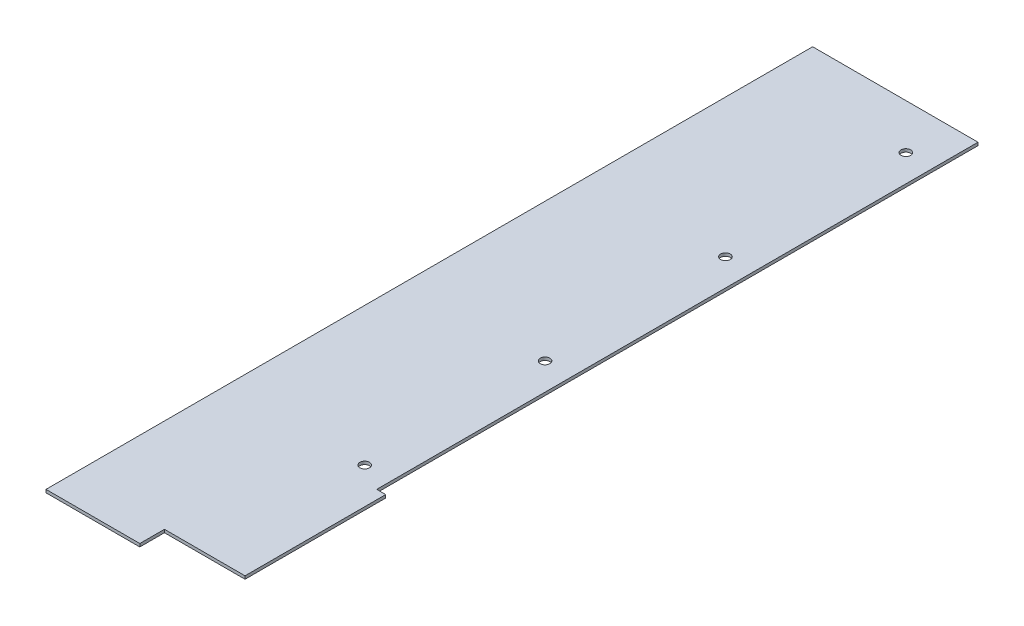
ISO-10303-21;
HEADER;
FILE_DESCRIPTION(('STEP AP214'),'2;1');
FILE_NAME('part.step','',(''),(''),'','','');
FILE_SCHEMA(('AUTOMOTIVE_DESIGN { 1 0 10303 214 1 1 1 1 }'));
ENDSEC;
DATA;
#1=APPLICATION_CONTEXT('core data for automotive mechanical design processes');
#2=APPLICATION_PROTOCOL_DEFINITION('international standard','automotive_design',2000,#1);
#3=PRODUCT_CONTEXT('',#1,'mechanical');
#4=PRODUCT('Part','Part','',(#3));
#5=PRODUCT_RELATED_PRODUCT_CATEGORY('part','',(#4));
#6=PRODUCT_DEFINITION_FORMATION('','',#4);
#7=PRODUCT_DEFINITION_CONTEXT('part definition',#1,'design');
#8=PRODUCT_DEFINITION('design','',#6,#7);
#9=PRODUCT_DEFINITION_SHAPE('','',#8);
#10=(LENGTH_UNIT() NAMED_UNIT(*) SI_UNIT(.MILLI.,.METRE.));
#11=(NAMED_UNIT(*) PLANE_ANGLE_UNIT() SI_UNIT($,.RADIAN.));
#12=(NAMED_UNIT(*) SI_UNIT($,.STERADIAN.) SOLID_ANGLE_UNIT());
#13=UNCERTAINTY_MEASURE_WITH_UNIT(LENGTH_MEASURE(1.E-05),#10,'distance_accuracy_value','');
#14=(GEOMETRIC_REPRESENTATION_CONTEXT(3) GLOBAL_UNCERTAINTY_ASSIGNED_CONTEXT((#13)) GLOBAL_UNIT_ASSIGNED_CONTEXT((#10,
#11,#12)) REPRESENTATION_CONTEXT('',''));
#15=CARTESIAN_POINT('',(0.,0.,0.));
#16=DIRECTION('',(0.,0.,1.));
#17=DIRECTION('',(1.,0.,0.));
#18=AXIS2_PLACEMENT_3D('',#15,#16,#17);
#19=CARTESIAN_POINT('',(0.,1.,0.));
#20=DIRECTION('',(0.,1.,0.));
#21=DIRECTION('',(0.,0.,1.));
#22=AXIS2_PLACEMENT_3D('',#19,#20,#21);
#23=PLANE('',#22);
#24=CARTESIAN_POINT('',(45.9999999999996,1.,-180.));
#25=DIRECTION('',(0.,1.,0.));
#26=DIRECTION('',(0.,0.,1.));
#27=AXIS2_PLACEMENT_3D('',#24,#25,#26);
#28=CIRCLE('',#27,1.6);
#29=CARTESIAN_POINT('',(45.9999999999996,1.,-178.4));
#30=VERTEX_POINT('',#29);
#31=EDGE_CURVE('E192',#30,#30,#28,.T.);
#32=ORIENTED_EDGE('',*,*,#31,.F.);
#33=EDGE_LOOP('',(#32));
#34=FACE_BOUND('',#33,.T.);
#35=CARTESIAN_POINT('',(46.,1.,-60.));
#36=DIRECTION('',(0.,1.,0.));
#37=DIRECTION('',(0.,0.,1.));
#38=AXIS2_PLACEMENT_3D('',#35,#36,#37);
#39=CIRCLE('',#38,1.6);
#40=CARTESIAN_POINT('',(46.,1.,-58.4));
#41=VERTEX_POINT('',#40);
#42=EDGE_CURVE('E136',#41,#41,#39,.T.);
#43=ORIENTED_EDGE('',*,*,#42,.F.);
#44=EDGE_LOOP('',(#43));
#45=FACE_BOUND('',#44,.T.);
#46=DIRECTION('',(1.,0.,0.));
#47=VECTOR('',#46,1.);
#48=CARTESIAN_POINT('',(0.,1.,0.));
#49=LINE('',#48,#47);
#50=CARTESIAN_POINT('',(0.,1.,0.));
#51=VERTEX_POINT('',#50);
#52=CARTESIAN_POINT('',(31.2,1.,0.));
#53=VERTEX_POINT('',#52);
#54=EDGE_CURVE('E148',#51,#53,#49,.T.);
#55=ORIENTED_EDGE('',*,*,#54,.T.);
#56=DIRECTION('',(0.,0.,-1.));
#57=VECTOR('',#56,1.);
#58=CARTESIAN_POINT('',(31.2,1.,0.));
#59=LINE('',#58,#57);
#60=CARTESIAN_POINT('',(31.2,1.,-8.2));
#61=VERTEX_POINT('',#60);
#62=EDGE_CURVE('E95',#53,#61,#59,.T.);
#63=ORIENTED_EDGE('',*,*,#62,.T.);
#64=DIRECTION('',(1.,0.,0.));
#65=VECTOR('',#64,1.);
#66=CARTESIAN_POINT('',(31.2,1.,-8.2));
#67=LINE('',#66,#65);
#68=CARTESIAN_POINT('',(58.,1.,-8.2));
#69=VERTEX_POINT('',#68);
#70=EDGE_CURVE('E162',#61,#69,#67,.T.);
#71=ORIENTED_EDGE('',*,*,#70,.T.);
#72=DIRECTION('',(0.,0.,-1.));
#73=VECTOR('',#72,1.);
#74=CARTESIAN_POINT('',(58.,1.,-55.));
#75=LINE('',#74,#73);
#76=CARTESIAN_POINT('',(58.,1.,-55.));
#77=VERTEX_POINT('',#76);
#78=EDGE_CURVE('E177',#69,#77,#75,.T.);
#79=ORIENTED_EDGE('',*,*,#78,.T.);
#80=DIRECTION('',(-1.,0.,0.));
#81=VECTOR('',#80,1.);
#82=CARTESIAN_POINT('',(55.,1.,-55.));
#83=LINE('',#82,#81);
#84=CARTESIAN_POINT('',(55.,1.,-55.));
#85=VERTEX_POINT('',#84);
#86=EDGE_CURVE('E114',#77,#85,#83,.T.);
#87=ORIENTED_EDGE('',*,*,#86,.T.);
#88=DIRECTION('',(0.,0.,-1.));
#89=VECTOR('',#88,1.);
#90=CARTESIAN_POINT('',(55.,1.,-255.));
#91=LINE('',#90,#89);
#92=CARTESIAN_POINT('',(55.,1.,-255.));
#93=VERTEX_POINT('',#92);
#94=EDGE_CURVE('E108',#85,#93,#91,.T.);
#95=ORIENTED_EDGE('',*,*,#94,.T.);
#96=DIRECTION('',(-1.,0.,0.));
#97=VECTOR('',#96,1.);
#98=CARTESIAN_POINT('',(0.,1.,-255.));
#99=LINE('',#98,#97);
#100=CARTESIAN_POINT('',(0.,1.,-255.));
#101=VERTEX_POINT('',#100);
#102=EDGE_CURVE('E112',#93,#101,#99,.T.);
#103=ORIENTED_EDGE('',*,*,#102,.T.);
#104=DIRECTION('',(0.,0.,1.));
#105=VECTOR('',#104,1.);
#106=CARTESIAN_POINT('',(0.,1.,0.));
#107=LINE('',#106,#105);
#108=EDGE_CURVE('E52',#101,#51,#107,.T.);
#109=ORIENTED_EDGE('',*,*,#108,.T.);
#110=EDGE_LOOP('',(#55,#63,#71,#79,#87,#95,#103,#109));
#111=FACE_BOUND('',#110,.T.);
#112=CARTESIAN_POINT('',(45.9999999999998,1.,-120.));
#113=DIRECTION('',(0.,1.,0.));
#114=DIRECTION('',(0.,0.,1.));
#115=AXIS2_PLACEMENT_3D('',#112,#113,#114);
#116=CIRCLE('',#115,1.6);
#117=CARTESIAN_POINT('',(45.9999999999998,1.,-118.4));
#118=VERTEX_POINT('',#117);
#119=EDGE_CURVE('E186',#118,#118,#116,.T.);
#120=ORIENTED_EDGE('',*,*,#119,.F.);
#121=EDGE_LOOP('',(#120));
#122=FACE_BOUND('',#121,.T.);
#123=CARTESIAN_POINT('',(45.9999999999994,1.,-240.));
#124=DIRECTION('',(0.,1.,0.));
#125=DIRECTION('',(0.,0.,1.));
#126=AXIS2_PLACEMENT_3D('',#123,#124,#125);
#127=CIRCLE('',#126,1.6);
#128=CARTESIAN_POINT('',(45.9999999999994,1.,-238.4));
#129=VERTEX_POINT('',#128);
#130=EDGE_CURVE('E198',#129,#129,#127,.T.);
#131=ORIENTED_EDGE('',*,*,#130,.F.);
#132=EDGE_LOOP('',(#131));
#133=FACE_BOUND('',#132,.T.);
#134=ADVANCED_FACE('F35',(#34,#45,#111,#122,#133),#23,.T.);
#135=CARTESIAN_POINT('',(0.,0.,0.));
#136=DIRECTION('',(0.,1.,0.));
#137=DIRECTION('',(0.,0.,1.));
#138=AXIS2_PLACEMENT_3D('',#135,#136,#137);
#139=PLANE('',#138);
#140=CARTESIAN_POINT('',(45.9999999999996,0.,-180.));
#141=DIRECTION('',(0.,1.,0.));
#142=DIRECTION('',(0.,0.,1.));
#143=AXIS2_PLACEMENT_3D('',#140,#141,#142);
#144=CIRCLE('',#143,1.6);
#145=CARTESIAN_POINT('',(45.9999999999996,0.,-178.4));
#146=VERTEX_POINT('',#145);
#147=EDGE_CURVE('E195',#146,#146,#144,.T.);
#148=ORIENTED_EDGE('',*,*,#147,.T.);
#149=EDGE_LOOP('',(#148));
#150=FACE_BOUND('',#149,.T.);
#151=CARTESIAN_POINT('',(46.,0.,-60.));
#152=DIRECTION('',(0.,1.,0.));
#153=DIRECTION('',(0.,0.,1.));
#154=AXIS2_PLACEMENT_3D('',#151,#152,#153);
#155=CIRCLE('',#154,1.6);
#156=CARTESIAN_POINT('',(46.,0.,-58.4));
#157=VERTEX_POINT('',#156);
#158=EDGE_CURVE('E183',#157,#157,#155,.T.);
#159=ORIENTED_EDGE('',*,*,#158,.T.);
#160=EDGE_LOOP('',(#159));
#161=FACE_BOUND('',#160,.T.);
#162=DIRECTION('',(1.,0.,0.));
#163=VECTOR('',#162,1.);
#164=CARTESIAN_POINT('',(0.,0.,0.));
#165=LINE('',#164,#163);
#166=CARTESIAN_POINT('',(0.,0.,0.));
#167=VERTEX_POINT('',#166);
#168=CARTESIAN_POINT('',(31.2,0.,0.));
#169=VERTEX_POINT('',#168);
#170=EDGE_CURVE('E132',#167,#169,#165,.T.);
#171=ORIENTED_EDGE('',*,*,#170,.F.);
#172=DIRECTION('',(0.,0.,1.));
#173=VECTOR('',#172,1.);
#174=CARTESIAN_POINT('',(0.,0.,0.));
#175=LINE('',#174,#173);
#176=CARTESIAN_POINT('',(0.,0.,-255.));
#177=VERTEX_POINT('',#176);
#178=EDGE_CURVE('E87',#177,#167,#175,.T.);
#179=ORIENTED_EDGE('',*,*,#178,.F.);
#180=DIRECTION('',(-1.,0.,0.));
#181=VECTOR('',#180,1.);
#182=CARTESIAN_POINT('',(0.,0.,-255.));
#183=LINE('',#182,#181);
#184=CARTESIAN_POINT('',(55.,0.,-255.));
#185=VERTEX_POINT('',#184);
#186=EDGE_CURVE('E81',#185,#177,#183,.T.);
#187=ORIENTED_EDGE('',*,*,#186,.F.);
#188=DIRECTION('',(0.,0.,-1.));
#189=VECTOR('',#188,1.);
#190=CARTESIAN_POINT('',(55.,0.,-255.));
#191=LINE('',#190,#189);
#192=CARTESIAN_POINT('',(55.,0.,-55.));
#193=VERTEX_POINT('',#192);
#194=EDGE_CURVE('E122',#193,#185,#191,.T.);
#195=ORIENTED_EDGE('',*,*,#194,.F.);
#196=DIRECTION('',(-1.,0.,0.));
#197=VECTOR('',#196,1.);
#198=CARTESIAN_POINT('',(55.,0.,-55.));
#199=LINE('',#198,#197);
#200=CARTESIAN_POINT('',(58.,0.,-55.));
#201=VERTEX_POINT('',#200);
#202=EDGE_CURVE('E143',#201,#193,#199,.T.);
#203=ORIENTED_EDGE('',*,*,#202,.F.);
#204=DIRECTION('',(0.,0.,-1.));
#205=VECTOR('',#204,1.);
#206=CARTESIAN_POINT('',(58.,0.,-55.));
#207=LINE('',#206,#205);
#208=CARTESIAN_POINT('',(58.,0.,-8.2));
#209=VERTEX_POINT('',#208);
#210=EDGE_CURVE('E141',#209,#201,#207,.T.);
#211=ORIENTED_EDGE('',*,*,#210,.F.);
#212=DIRECTION('',(1.,0.,0.));
#213=VECTOR('',#212,1.);
#214=CARTESIAN_POINT('',(58.,0.,-8.2));
#215=LINE('',#214,#213);
#216=CARTESIAN_POINT('',(31.2,0.,-8.2));
#217=VERTEX_POINT('',#216);
#218=EDGE_CURVE('E139',#217,#209,#215,.T.);
#219=ORIENTED_EDGE('',*,*,#218,.F.);
#220=DIRECTION('',(0.,0.,-1.));
#221=VECTOR('',#220,1.);
#222=CARTESIAN_POINT('',(31.2,0.,0.));
#223=LINE('',#222,#221);
#224=EDGE_CURVE('E135',#169,#217,#223,.T.);
#225=ORIENTED_EDGE('',*,*,#224,.F.);
#226=EDGE_LOOP('',(#171,#179,#187,#195,#203,#211,#219,#225));
#227=FACE_BOUND('',#226,.T.);
#228=CARTESIAN_POINT('',(45.9999999999998,0.,-120.));
#229=DIRECTION('',(0.,1.,0.));
#230=DIRECTION('',(0.,0.,1.));
#231=AXIS2_PLACEMENT_3D('',#228,#229,#230);
#232=CIRCLE('',#231,1.6);
#233=CARTESIAN_POINT('',(45.9999999999998,0.,-118.4));
#234=VERTEX_POINT('',#233);
#235=EDGE_CURVE('E189',#234,#234,#232,.T.);
#236=ORIENTED_EDGE('',*,*,#235,.T.);
#237=EDGE_LOOP('',(#236));
#238=FACE_BOUND('',#237,.T.);
#239=CARTESIAN_POINT('',(45.9999999999994,0.,-240.));
#240=DIRECTION('',(0.,1.,0.));
#241=DIRECTION('',(0.,0.,1.));
#242=AXIS2_PLACEMENT_3D('',#239,#240,#241);
#243=CIRCLE('',#242,1.6);
#244=CARTESIAN_POINT('',(45.9999999999994,0.,-238.4));
#245=VERTEX_POINT('',#244);
#246=EDGE_CURVE('E201',#245,#245,#243,.T.);
#247=ORIENTED_EDGE('',*,*,#246,.T.);
#248=EDGE_LOOP('',(#247));
#249=FACE_BOUND('',#248,.T.);
#250=ADVANCED_FACE('F167',(#150,#161,#227,#238,#249),#139,.F.);
#251=CARTESIAN_POINT('',(0.,1.,0.));
#252=DIRECTION('',(0.,0.,-1.));
#253=DIRECTION('',(-1.,0.,0.));
#254=AXIS2_PLACEMENT_3D('',#251,#252,#253);
#255=PLANE('',#254);
#256=ORIENTED_EDGE('',*,*,#170,.T.);
#257=DIRECTION('',(0.,-1.,0.));
#258=VECTOR('',#257,1.);
#259=CARTESIAN_POINT('',(31.2,1.,0.));
#260=LINE('',#259,#258);
#261=EDGE_CURVE('E11',#53,#169,#260,.T.);
#262=ORIENTED_EDGE('',*,*,#261,.F.);
#263=ORIENTED_EDGE('',*,*,#54,.F.);
#264=DIRECTION('',(0.,-1.,0.));
#265=VECTOR('',#264,1.);
#266=CARTESIAN_POINT('',(0.,1.,0.));
#267=LINE('',#266,#265);
#268=EDGE_CURVE('E128',#51,#167,#267,.T.);
#269=ORIENTED_EDGE('',*,*,#268,.T.);
#270=EDGE_LOOP('',(#256,#262,#263,#269));
#271=FACE_BOUND('',#270,.T.);
#272=ADVANCED_FACE('F37',(#271),#255,.F.);
#273=CARTESIAN_POINT('',(31.2,1.,0.));
#274=DIRECTION('',(-1.,0.,0.));
#275=DIRECTION('',(0.,0.,1.));
#276=AXIS2_PLACEMENT_3D('',#273,#274,#275);
#277=PLANE('',#276);
#278=ORIENTED_EDGE('',*,*,#224,.T.);
#279=DIRECTION('',(0.,-1.,0.));
#280=VECTOR('',#279,1.);
#281=CARTESIAN_POINT('',(31.2,1.,-8.2));
#282=LINE('',#281,#280);
#283=EDGE_CURVE('E44',#61,#217,#282,.T.);
#284=ORIENTED_EDGE('',*,*,#283,.F.);
#285=ORIENTED_EDGE('',*,*,#62,.F.);
#286=ORIENTED_EDGE('',*,*,#261,.T.);
#287=EDGE_LOOP('',(#278,#284,#285,#286));
#288=FACE_BOUND('',#287,.T.);
#289=ADVANCED_FACE('F163',(#288),#277,.F.);
#290=CARTESIAN_POINT('',(58.,1.,-8.2));
#291=DIRECTION('',(0.,0.,-1.));
#292=DIRECTION('',(-1.,0.,0.));
#293=AXIS2_PLACEMENT_3D('',#290,#291,#292);
#294=PLANE('',#293);
#295=ORIENTED_EDGE('',*,*,#218,.T.);
#296=DIRECTION('',(0.,-1.,0.));
#297=VECTOR('',#296,1.);
#298=CARTESIAN_POINT('',(58.,1.,-8.2));
#299=LINE('',#298,#297);
#300=EDGE_CURVE('E155',#69,#209,#299,.T.);
#301=ORIENTED_EDGE('',*,*,#300,.F.);
#302=ORIENTED_EDGE('',*,*,#70,.F.);
#303=ORIENTED_EDGE('',*,*,#283,.T.);
#304=EDGE_LOOP('',(#295,#301,#302,#303));
#305=FACE_BOUND('',#304,.T.);
#306=ADVANCED_FACE('F160',(#305),#294,.F.);
#307=CARTESIAN_POINT('',(58.,1.,-55.));
#308=DIRECTION('',(-1.,0.,0.));
#309=DIRECTION('',(0.,0.,1.));
#310=AXIS2_PLACEMENT_3D('',#307,#308,#309);
#311=PLANE('',#310);
#312=ORIENTED_EDGE('',*,*,#210,.T.);
#313=DIRECTION('',(0.,-1.,0.));
#314=VECTOR('',#313,1.);
#315=CARTESIAN_POINT('',(58.,1.,-55.));
#316=LINE('',#315,#314);
#317=EDGE_CURVE('E152',#77,#201,#316,.T.);
#318=ORIENTED_EDGE('',*,*,#317,.F.);
#319=ORIENTED_EDGE('',*,*,#78,.F.);
#320=ORIENTED_EDGE('',*,*,#300,.T.);
#321=EDGE_LOOP('',(#312,#318,#319,#320));
#322=FACE_BOUND('',#321,.T.);
#323=ADVANCED_FACE('F173',(#322),#311,.F.);
#324=CARTESIAN_POINT('',(55.,1.,-55.));
#325=DIRECTION('',(0.,0.,1.));
#326=DIRECTION('',(1.,0.,0.));
#327=AXIS2_PLACEMENT_3D('',#324,#325,#326);
#328=PLANE('',#327);
#329=ORIENTED_EDGE('',*,*,#202,.T.);
#330=DIRECTION('',(0.,-1.,0.));
#331=VECTOR('',#330,1.);
#332=CARTESIAN_POINT('',(55.,1.,-55.));
#333=LINE('',#332,#331);
#334=EDGE_CURVE('E123',#85,#193,#333,.T.);
#335=ORIENTED_EDGE('',*,*,#334,.F.);
#336=ORIENTED_EDGE('',*,*,#86,.F.);
#337=ORIENTED_EDGE('',*,*,#317,.T.);
#338=EDGE_LOOP('',(#329,#335,#336,#337));
#339=FACE_BOUND('',#338,.T.);
#340=ADVANCED_FACE('F176',(#339),#328,.F.);
#341=CARTESIAN_POINT('',(55.,1.,-255.));
#342=DIRECTION('',(-1.,0.,0.));
#343=DIRECTION('',(0.,0.,1.));
#344=AXIS2_PLACEMENT_3D('',#341,#342,#343);
#345=PLANE('',#344);
#346=ORIENTED_EDGE('',*,*,#194,.T.);
#347=DIRECTION('',(0.,-1.,0.));
#348=VECTOR('',#347,1.);
#349=CARTESIAN_POINT('',(55.,1.,-255.));
#350=LINE('',#349,#348);
#351=EDGE_CURVE('E119',#93,#185,#350,.T.);
#352=ORIENTED_EDGE('',*,*,#351,.F.);
#353=ORIENTED_EDGE('',*,*,#94,.F.);
#354=ORIENTED_EDGE('',*,*,#334,.T.);
#355=EDGE_LOOP('',(#346,#352,#353,#354));
#356=FACE_BOUND('',#355,.T.);
#357=ADVANCED_FACE('F120',(#356),#345,.F.);
#358=CARTESIAN_POINT('',(0.,1.,-255.));
#359=DIRECTION('',(0.,0.,1.));
#360=DIRECTION('',(1.,0.,0.));
#361=AXIS2_PLACEMENT_3D('',#358,#359,#360);
#362=PLANE('',#361);
#363=ORIENTED_EDGE('',*,*,#186,.T.);
#364=DIRECTION('',(0.,-1.,0.));
#365=VECTOR('',#364,1.);
#366=CARTESIAN_POINT('',(0.,1.,-255.));
#367=LINE('',#366,#365);
#368=EDGE_CURVE('E124',#101,#177,#367,.T.);
#369=ORIENTED_EDGE('',*,*,#368,.F.);
#370=ORIENTED_EDGE('',*,*,#102,.F.);
#371=ORIENTED_EDGE('',*,*,#351,.T.);
#372=EDGE_LOOP('',(#363,#369,#370,#371));
#373=FACE_BOUND('',#372,.T.);
#374=ADVANCED_FACE('F126',(#373),#362,.F.);
#375=CARTESIAN_POINT('',(0.,1.,0.));
#376=DIRECTION('',(1.,0.,0.));
#377=DIRECTION('',(0.,0.,-1.));
#378=AXIS2_PLACEMENT_3D('',#375,#376,#377);
#379=PLANE('',#378);
#380=ORIENTED_EDGE('',*,*,#178,.T.);
#381=ORIENTED_EDGE('',*,*,#268,.F.);
#382=ORIENTED_EDGE('',*,*,#108,.F.);
#383=ORIENTED_EDGE('',*,*,#368,.T.);
#384=EDGE_LOOP('',(#380,#381,#382,#383));
#385=FACE_BOUND('',#384,.T.);
#386=ADVANCED_FACE('F224',(#385),#379,.F.);
#387=CARTESIAN_POINT('',(46.,1.,-60.));
#388=DIRECTION('',(0.,-1.,0.));
#389=DIRECTION('',(0.,0.,-1.));
#390=AXIS2_PLACEMENT_3D('',#387,#388,#389);
#391=CYLINDRICAL_SURFACE('',#390,1.6);
#392=ORIENTED_EDGE('',*,*,#42,.T.);
#393=EDGE_LOOP('',(#392));
#394=FACE_BOUND('',#393,.T.);
#395=ORIENTED_EDGE('',*,*,#158,.F.);
#396=EDGE_LOOP('',(#395));
#397=FACE_BOUND('',#396,.T.);
#398=ADVANCED_FACE('F221',(#394,#397),#391,.F.);
#399=CARTESIAN_POINT('',(45.9999999999998,1.,-120.));
#400=DIRECTION('',(0.,-1.,0.));
#401=DIRECTION('',(0.,0.,-1.));
#402=AXIS2_PLACEMENT_3D('',#399,#400,#401);
#403=CYLINDRICAL_SURFACE('',#402,1.6);
#404=ORIENTED_EDGE('',*,*,#119,.T.);
#405=EDGE_LOOP('',(#404));
#406=FACE_BOUND('',#405,.T.);
#407=ORIENTED_EDGE('',*,*,#235,.F.);
#408=EDGE_LOOP('',(#407));
#409=FACE_BOUND('',#408,.T.);
#410=ADVANCED_FACE('F301',(#406,#409),#403,.F.);
#411=CARTESIAN_POINT('',(45.9999999999996,1.,-180.));
#412=DIRECTION('',(0.,-1.,0.));
#413=DIRECTION('',(0.,0.,-1.));
#414=AXIS2_PLACEMENT_3D('',#411,#412,#413);
#415=CYLINDRICAL_SURFACE('',#414,1.6);
#416=ORIENTED_EDGE('',*,*,#31,.T.);
#417=EDGE_LOOP('',(#416));
#418=FACE_BOUND('',#417,.T.);
#419=ORIENTED_EDGE('',*,*,#147,.F.);
#420=EDGE_LOOP('',(#419));
#421=FACE_BOUND('',#420,.T.);
#422=ADVANCED_FACE('F309',(#418,#421),#415,.F.);
#423=CARTESIAN_POINT('',(45.9999999999994,1.,-240.));
#424=DIRECTION('',(0.,-1.,0.));
#425=DIRECTION('',(0.,0.,-1.));
#426=AXIS2_PLACEMENT_3D('',#423,#424,#425);
#427=CYLINDRICAL_SURFACE('',#426,1.6);
#428=ORIENTED_EDGE('',*,*,#130,.T.);
#429=EDGE_LOOP('',(#428));
#430=FACE_BOUND('',#429,.T.);
#431=ORIENTED_EDGE('',*,*,#246,.F.);
#432=EDGE_LOOP('',(#431));
#433=FACE_BOUND('',#432,.T.);
#434=ADVANCED_FACE('F207',(#430,#433),#427,.F.);
#435=CLOSED_SHELL('',(#134,#250,#272,#289,#306,#323,#340,#357,#374,#386,#398,#410,#422,#434));
#436=MANIFOLD_SOLID_BREP('B2',#435);
#437=ADVANCED_BREP_SHAPE_REPRESENTATION('',(#18,#436),#14);
#438=SHAPE_DEFINITION_REPRESENTATION(#9,#437);
ENDSEC;
END-ISO-10303-21;
